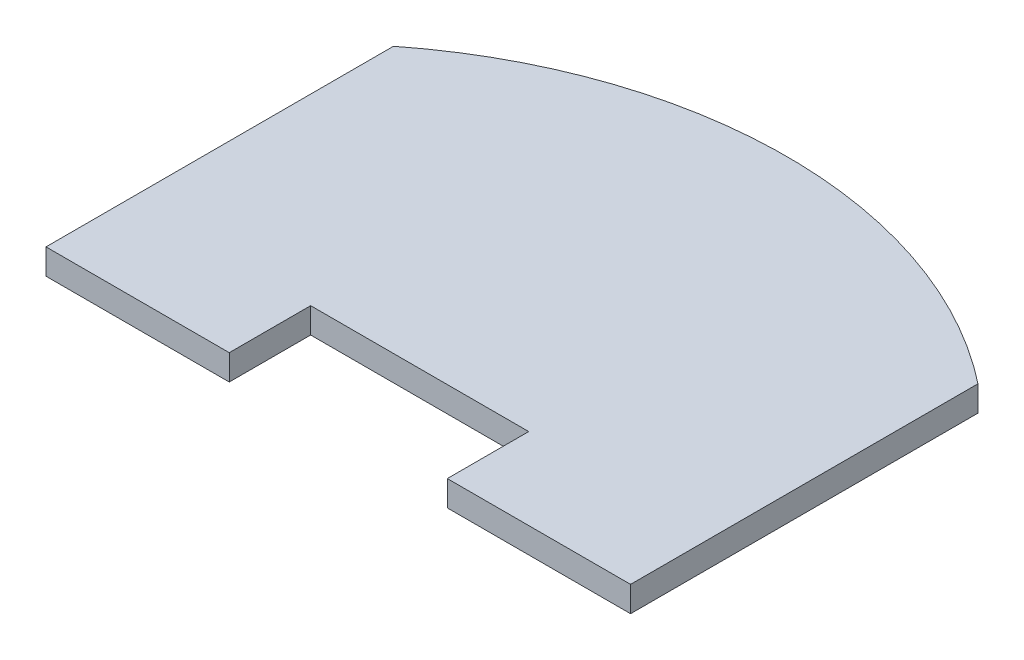
ISO-10303-21;
HEADER;
FILE_DESCRIPTION(('STEP AP214'),'2;1');
FILE_NAME('part.step','',(''),(''),'','','');
FILE_SCHEMA(('AUTOMOTIVE_DESIGN { 1 0 10303 214 1 1 1 1 }'));
ENDSEC;
DATA;
#1=APPLICATION_CONTEXT('core data for automotive mechanical design processes');
#2=APPLICATION_PROTOCOL_DEFINITION('international standard','automotive_design',2000,#1);
#3=PRODUCT_CONTEXT('',#1,'mechanical');
#4=PRODUCT('Part','Part','',(#3));
#5=PRODUCT_RELATED_PRODUCT_CATEGORY('part','',(#4));
#6=PRODUCT_DEFINITION_FORMATION('','',#4);
#7=PRODUCT_DEFINITION_CONTEXT('part definition',#1,'design');
#8=PRODUCT_DEFINITION('design','',#6,#7);
#9=PRODUCT_DEFINITION_SHAPE('','',#8);
#10=(LENGTH_UNIT() NAMED_UNIT(*) SI_UNIT(.MILLI.,.METRE.));
#11=(NAMED_UNIT(*) PLANE_ANGLE_UNIT() SI_UNIT($,.RADIAN.));
#12=(NAMED_UNIT(*) SI_UNIT($,.STERADIAN.) SOLID_ANGLE_UNIT());
#13=UNCERTAINTY_MEASURE_WITH_UNIT(LENGTH_MEASURE(1.E-05),#10,'distance_accuracy_value','');
#14=(GEOMETRIC_REPRESENTATION_CONTEXT(3) GLOBAL_UNCERTAINTY_ASSIGNED_CONTEXT((#13)) GLOBAL_UNIT_ASSIGNED_CONTEXT((#10,
#11,#12)) REPRESENTATION_CONTEXT('',''));
#15=CARTESIAN_POINT('',(0.,0.,0.));
#16=DIRECTION('',(0.,0.,1.));
#17=DIRECTION('',(1.,0.,0.));
#18=AXIS2_PLACEMENT_3D('',#15,#16,#17);
#19=CARTESIAN_POINT('',(19.05,4.445,-4.15000947331262));
#20=DIRECTION('',(0.,0.,-1.));
#21=DIRECTION('',(-1.,0.,0.));
#22=AXIS2_PLACEMENT_3D('',#19,#20,#21);
#23=PLANE('',#22);
#24=DIRECTION('',(1.,0.,0.));
#25=VECTOR('',#24,1.);
#26=CARTESIAN_POINT('',(19.05,0.,-4.15000947331262));
#27=LINE('',#26,#25);
#28=CARTESIAN_POINT('',(19.05,0.,-4.15000947331262));
#29=VERTEX_POINT('',#28);
#30=CARTESIAN_POINT('',(51.0688937102373,0.,-4.15000947331262));
#31=VERTEX_POINT('',#30);
#32=EDGE_CURVE('E128',#29,#31,#27,.T.);
#33=ORIENTED_EDGE('',*,*,#32,.T.);
#34=DIRECTION('',(0.,-1.,0.));
#35=VECTOR('',#34,1.);
#36=CARTESIAN_POINT('',(51.0688937102373,4.445,-4.15000947331262));
#37=LINE('',#36,#35);
#38=CARTESIAN_POINT('',(51.0688937102373,4.445,-4.15000947331262));
#39=VERTEX_POINT('',#38);
#40=EDGE_CURVE('E11',#39,#31,#37,.T.);
#41=ORIENTED_EDGE('',*,*,#40,.F.);
#42=DIRECTION('',(1.,0.,0.));
#43=VECTOR('',#42,1.);
#44=CARTESIAN_POINT('',(19.05,4.445,-4.15000947331262));
#45=LINE('',#44,#43);
#46=CARTESIAN_POINT('',(19.05,4.445,-4.15000947331262));
#47=VERTEX_POINT('',#46);
#48=EDGE_CURVE('E144',#47,#39,#45,.T.);
#49=ORIENTED_EDGE('',*,*,#48,.F.);
#50=DIRECTION('',(0.,-1.,0.));
#51=VECTOR('',#50,1.);
#52=CARTESIAN_POINT('',(19.05,4.445,-4.15000947331262));
#53=LINE('',#52,#51);
#54=EDGE_CURVE('E124',#47,#29,#53,.T.);
#55=ORIENTED_EDGE('',*,*,#54,.T.);
#56=EDGE_LOOP('',(#33,#41,#49,#55));
#57=FACE_BOUND('',#56,.T.);
#58=ADVANCED_FACE('F32',(#57),#23,.F.);
#59=CARTESIAN_POINT('',(51.0688937102373,4.445,-4.15000947331262));
#60=DIRECTION('',(-1.,0.,0.));
#61=DIRECTION('',(0.,0.,1.));
#62=AXIS2_PLACEMENT_3D('',#59,#60,#61);
#63=PLANE('',#62);
#64=DIRECTION('',(0.,0.,-1.));
#65=VECTOR('',#64,1.);
#66=CARTESIAN_POINT('',(51.0688937102373,0.,-4.15000947331262));
#67=LINE('',#66,#65);
#68=CARTESIAN_POINT('',(51.0688937102373,0.,-64.8573094971761));
#69=VERTEX_POINT('',#68);
#70=EDGE_CURVE('E131',#31,#69,#67,.T.);
#71=ORIENTED_EDGE('',*,*,#70,.T.);
#72=DIRECTION('',(0.,-1.,0.));
#73=VECTOR('',#72,1.);
#74=CARTESIAN_POINT('',(51.0688937102373,4.445,-64.8573094971761));
#75=LINE('',#74,#73);
#76=CARTESIAN_POINT('',(51.0688937102373,4.445,-64.8573094971761));
#77=VERTEX_POINT('',#76);
#78=EDGE_CURVE('E40',#77,#69,#75,.T.);
#79=ORIENTED_EDGE('',*,*,#78,.F.);
#80=DIRECTION('',(0.,0.,-1.));
#81=VECTOR('',#80,1.);
#82=CARTESIAN_POINT('',(51.0688937102373,4.445,-4.15000947331262));
#83=LINE('',#82,#81);
#84=EDGE_CURVE('E89',#39,#77,#83,.T.);
#85=ORIENTED_EDGE('',*,*,#84,.F.);
#86=ORIENTED_EDGE('',*,*,#40,.T.);
#87=EDGE_LOOP('',(#71,#79,#85,#86));
#88=FACE_BOUND('',#87,.T.);
#89=ADVANCED_FACE('F177',(#88),#63,.F.);
#90=CARTESIAN_POINT('',(0.,4.445,0.));
#91=DIRECTION('',(0.,-1.,0.));
#92=DIRECTION('',(0.,0.,-1.));
#93=AXIS2_PLACEMENT_3D('',#90,#91,#92);
#94=CYLINDRICAL_SURFACE('',#93,82.55);
#95=CARTESIAN_POINT('',(0.,0.,0.));
#96=DIRECTION('',(0.,1.,0.));
#97=DIRECTION('',(0.,0.,-1.));
#98=AXIS2_PLACEMENT_3D('',#95,#96,#97);
#99=CIRCLE('',#98,82.55);
#100=CARTESIAN_POINT('',(-51.0688937102373,0.,-64.8573094971761));
#101=VERTEX_POINT('',#100);
#102=EDGE_CURVE('E133',#69,#101,#99,.T.);
#103=ORIENTED_EDGE('',*,*,#102,.T.);
#104=DIRECTION('',(0.,-1.,0.));
#105=VECTOR('',#104,1.);
#106=CARTESIAN_POINT('',(-51.0688937102373,4.445,-64.8573094971761));
#107=LINE('',#106,#105);
#108=CARTESIAN_POINT('',(-51.0688937102373,4.445,-64.8573094971761));
#109=VERTEX_POINT('',#108);
#110=EDGE_CURVE('E151',#109,#101,#107,.T.);
#111=ORIENTED_EDGE('',*,*,#110,.F.);
#112=CARTESIAN_POINT('',(0.,4.445,0.));
#113=DIRECTION('',(0.,1.,0.));
#114=DIRECTION('',(0.,0.,-1.));
#115=AXIS2_PLACEMENT_3D('',#112,#113,#114);
#116=CIRCLE('',#115,82.55);
#117=EDGE_CURVE('E159',#77,#109,#116,.T.);
#118=ORIENTED_EDGE('',*,*,#117,.F.);
#119=ORIENTED_EDGE('',*,*,#78,.T.);
#120=EDGE_LOOP('',(#103,#111,#118,#119));
#121=FACE_BOUND('',#120,.T.);
#122=ADVANCED_FACE('F157',(#121),#94,.T.);
#123=CARTESIAN_POINT('',(-51.0688937102372,4.445,-4.15000947331263));
#124=DIRECTION('',(1.,0.,0.));
#125=DIRECTION('',(0.,0.,-1.));
#126=AXIS2_PLACEMENT_3D('',#123,#124,#125);
#127=PLANE('',#126);
#128=DIRECTION('',(0.,0.,1.));
#129=VECTOR('',#128,1.);
#130=CARTESIAN_POINT('',(-51.0688937102372,0.,-4.15000947331263));
#131=LINE('',#130,#129);
#132=CARTESIAN_POINT('',(-51.0688937102372,0.,-4.15000947331263));
#133=VERTEX_POINT('',#132);
#134=EDGE_CURVE('E135',#101,#133,#131,.T.);
#135=ORIENTED_EDGE('',*,*,#134,.T.);
#136=DIRECTION('',(0.,-1.,0.));
#137=VECTOR('',#136,1.);
#138=CARTESIAN_POINT('',(-51.0688937102372,4.445,-4.15000947331263));
#139=LINE('',#138,#137);
#140=CARTESIAN_POINT('',(-51.0688937102372,4.445,-4.15000947331263));
#141=VERTEX_POINT('',#140);
#142=EDGE_CURVE('E148',#141,#133,#139,.T.);
#143=ORIENTED_EDGE('',*,*,#142,.F.);
#144=DIRECTION('',(0.,0.,1.));
#145=VECTOR('',#144,1.);
#146=CARTESIAN_POINT('',(-51.0688937102372,4.445,-4.15000947331263));
#147=LINE('',#146,#145);
#148=EDGE_CURVE('E169',#109,#141,#147,.T.);
#149=ORIENTED_EDGE('',*,*,#148,.F.);
#150=ORIENTED_EDGE('',*,*,#110,.T.);
#151=EDGE_LOOP('',(#135,#143,#149,#150));
#152=FACE_BOUND('',#151,.T.);
#153=ADVANCED_FACE('F165',(#152),#127,.F.);
#154=CARTESIAN_POINT('',(-51.0688937102372,4.445,-4.15000947331263));
#155=DIRECTION('',(0.,0.,-1.));
#156=DIRECTION('',(-1.,0.,0.));
#157=AXIS2_PLACEMENT_3D('',#154,#155,#156);
#158=PLANE('',#157);
#159=DIRECTION('',(1.,0.,0.));
#160=VECTOR('',#159,1.);
#161=CARTESIAN_POINT('',(-51.0688937102372,0.,-4.15000947331263));
#162=LINE('',#161,#160);
#163=CARTESIAN_POINT('',(-19.05,0.,-4.15000947331262));
#164=VERTEX_POINT('',#163);
#165=EDGE_CURVE('E137',#133,#164,#162,.T.);
#166=ORIENTED_EDGE('',*,*,#165,.T.);
#167=DIRECTION('',(0.,-1.,0.));
#168=VECTOR('',#167,1.);
#169=CARTESIAN_POINT('',(-19.05,4.445,-4.15000947331262));
#170=LINE('',#169,#168);
#171=CARTESIAN_POINT('',(-19.05,4.445,-4.15000947331262));
#172=VERTEX_POINT('',#171);
#173=EDGE_CURVE('E119',#172,#164,#170,.T.);
#174=ORIENTED_EDGE('',*,*,#173,.F.);
#175=DIRECTION('',(1.,0.,0.));
#176=VECTOR('',#175,1.);
#177=CARTESIAN_POINT('',(-51.0688937102372,4.445,-4.15000947331263));
#178=LINE('',#177,#176);
#179=EDGE_CURVE('E109',#141,#172,#178,.T.);
#180=ORIENTED_EDGE('',*,*,#179,.F.);
#181=ORIENTED_EDGE('',*,*,#142,.T.);
#182=EDGE_LOOP('',(#166,#174,#180,#181));
#183=FACE_BOUND('',#182,.T.);
#184=ADVANCED_FACE('F168',(#183),#158,.F.);
#185=CARTESIAN_POINT('',(-19.05,4.445,-18.3740094733126));
#186=DIRECTION('',(-1.,0.,0.));
#187=DIRECTION('',(0.,0.,1.));
#188=AXIS2_PLACEMENT_3D('',#185,#186,#187);
#189=PLANE('',#188);
#190=DIRECTION('',(0.,0.,-1.));
#191=VECTOR('',#190,1.);
#192=CARTESIAN_POINT('',(-19.05,0.,-18.3740094733126));
#193=LINE('',#192,#191);
#194=CARTESIAN_POINT('',(-19.05,0.,-18.3740094733126));
#195=VERTEX_POINT('',#194);
#196=EDGE_CURVE('E117',#164,#195,#193,.T.);
#197=ORIENTED_EDGE('',*,*,#196,.T.);
#198=DIRECTION('',(0.,-1.,0.));
#199=VECTOR('',#198,1.);
#200=CARTESIAN_POINT('',(-19.05,4.445,-18.3740094733126));
#201=LINE('',#200,#199);
#202=CARTESIAN_POINT('',(-19.05,4.445,-18.3740094733126));
#203=VERTEX_POINT('',#202);
#204=EDGE_CURVE('E115',#203,#195,#201,.T.);
#205=ORIENTED_EDGE('',*,*,#204,.F.);
#206=DIRECTION('',(0.,0.,-1.));
#207=VECTOR('',#206,1.);
#208=CARTESIAN_POINT('',(-19.05,4.445,-14.2875));
#209=LINE('',#208,#207);
#210=EDGE_CURVE('E102',#172,#203,#209,.T.);
#211=ORIENTED_EDGE('',*,*,#210,.F.);
#212=ORIENTED_EDGE('',*,*,#173,.T.);
#213=EDGE_LOOP('',(#197,#205,#211,#212));
#214=FACE_BOUND('',#213,.T.);
#215=ADVANCED_FACE('F116',(#214),#189,.F.);
#216=CARTESIAN_POINT('',(19.05,4.445,-18.3740094733126));
#217=DIRECTION('',(0.,0.,-1.));
#218=DIRECTION('',(-1.,0.,0.));
#219=AXIS2_PLACEMENT_3D('',#216,#217,#218);
#220=PLANE('',#219);
#221=DIRECTION('',(1.,0.,0.));
#222=VECTOR('',#221,1.);
#223=CARTESIAN_POINT('',(19.05,0.,-18.3740094733126));
#224=LINE('',#223,#222);
#225=CARTESIAN_POINT('',(19.05,0.,-18.3740094733126));
#226=VERTEX_POINT('',#225);
#227=EDGE_CURVE('E141',#195,#226,#224,.T.);
#228=ORIENTED_EDGE('',*,*,#227,.T.);
#229=DIRECTION('',(0.,-1.,0.));
#230=VECTOR('',#229,1.);
#231=CARTESIAN_POINT('',(19.05,4.445,-18.3740094733126));
#232=LINE('',#231,#230);
#233=CARTESIAN_POINT('',(19.05,4.445,-18.3740094733126));
#234=VERTEX_POINT('',#233);
#235=EDGE_CURVE('E120',#234,#226,#232,.T.);
#236=ORIENTED_EDGE('',*,*,#235,.F.);
#237=DIRECTION('',(1.,0.,0.));
#238=VECTOR('',#237,1.);
#239=CARTESIAN_POINT('',(19.05,4.445,-18.3740094733126));
#240=LINE('',#239,#238);
#241=EDGE_CURVE('E106',#203,#234,#240,.T.);
#242=ORIENTED_EDGE('',*,*,#241,.F.);
#243=ORIENTED_EDGE('',*,*,#204,.T.);
#244=EDGE_LOOP('',(#228,#236,#242,#243));
#245=FACE_BOUND('',#244,.T.);
#246=ADVANCED_FACE('F122',(#245),#220,.F.);
#247=CARTESIAN_POINT('',(19.05,4.445,-14.2875));
#248=DIRECTION('',(1.,0.,0.));
#249=DIRECTION('',(0.,0.,-1.));
#250=AXIS2_PLACEMENT_3D('',#247,#248,#249);
#251=PLANE('',#250);
#252=DIRECTION('',(0.,0.,1.));
#253=VECTOR('',#252,1.);
#254=CARTESIAN_POINT('',(19.05,0.,-14.2875));
#255=LINE('',#254,#253);
#256=EDGE_CURVE('E77',#226,#29,#255,.T.);
#257=ORIENTED_EDGE('',*,*,#256,.T.);
#258=ORIENTED_EDGE('',*,*,#54,.F.);
#259=DIRECTION('',(0.,0.,1.));
#260=VECTOR('',#259,1.);
#261=CARTESIAN_POINT('',(19.05,4.445,-18.3740094733126));
#262=LINE('',#261,#260);
#263=EDGE_CURVE('E48',#234,#47,#262,.T.);
#264=ORIENTED_EDGE('',*,*,#263,.F.);
#265=ORIENTED_EDGE('',*,*,#235,.T.);
#266=EDGE_LOOP('',(#257,#258,#264,#265));
#267=FACE_BOUND('',#266,.T.);
#268=ADVANCED_FACE('F193',(#267),#251,.F.);
#269=CARTESIAN_POINT('',(0.,4.445,0.));
#270=DIRECTION('',(0.,-1.,0.));
#271=DIRECTION('',(0.,0.,-1.));
#272=AXIS2_PLACEMENT_3D('',#269,#270,#271);
#273=PLANE('',#272);
#274=ORIENTED_EDGE('',*,*,#48,.T.);
#275=ORIENTED_EDGE('',*,*,#84,.T.);
#276=ORIENTED_EDGE('',*,*,#117,.T.);
#277=ORIENTED_EDGE('',*,*,#148,.T.);
#278=ORIENTED_EDGE('',*,*,#179,.T.);
#279=ORIENTED_EDGE('',*,*,#210,.T.);
#280=ORIENTED_EDGE('',*,*,#241,.T.);
#281=ORIENTED_EDGE('',*,*,#263,.T.);
#282=EDGE_LOOP('',(#274,#275,#276,#277,#278,#279,#280,#281));
#283=FACE_BOUND('',#282,.T.);
#284=ADVANCED_FACE('F104',(#283),#273,.F.);
#285=CARTESIAN_POINT('',(0.,0.,0.));
#286=DIRECTION('',(0.,-1.,0.));
#287=DIRECTION('',(0.,0.,-1.));
#288=AXIS2_PLACEMENT_3D('',#285,#286,#287);
#289=PLANE('',#288);
#290=ORIENTED_EDGE('',*,*,#32,.F.);
#291=ORIENTED_EDGE('',*,*,#256,.F.);
#292=ORIENTED_EDGE('',*,*,#227,.F.);
#293=ORIENTED_EDGE('',*,*,#196,.F.);
#294=ORIENTED_EDGE('',*,*,#165,.F.);
#295=ORIENTED_EDGE('',*,*,#134,.F.);
#296=ORIENTED_EDGE('',*,*,#102,.F.);
#297=ORIENTED_EDGE('',*,*,#70,.F.);
#298=EDGE_LOOP('',(#290,#291,#292,#293,#294,#295,#296,#297));
#299=FACE_BOUND('',#298,.T.);
#300=ADVANCED_FACE('F161',(#299),#289,.T.);
#301=CLOSED_SHELL('',(#58,#89,#122,#153,#184,#215,#246,#268,#284,#300));
#302=MANIFOLD_SOLID_BREP('B2',#301);
#303=ADVANCED_BREP_SHAPE_REPRESENTATION('',(#18,#302),#14);
#304=SHAPE_DEFINITION_REPRESENTATION(#9,#303);
ENDSEC;
END-ISO-10303-21;
